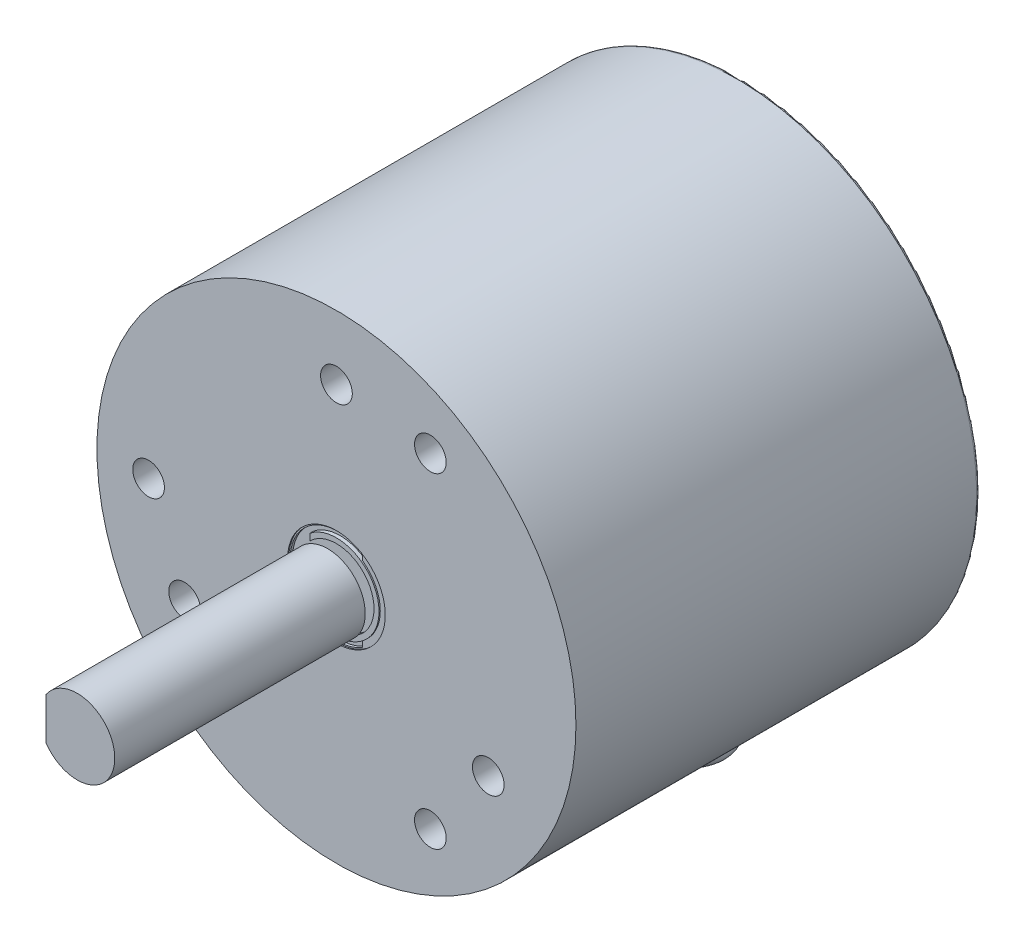
ISO-10303-21;
HEADER;
FILE_DESCRIPTION(('STEP AP214'),'2;1');
FILE_NAME('part.step','',(''),(''),'','','');
FILE_SCHEMA(('AUTOMOTIVE_DESIGN { 1 0 10303 214 1 1 1 1 }'));
ENDSEC;
DATA;
#1=APPLICATION_CONTEXT('core data for automotive mechanical design processes');
#2=APPLICATION_PROTOCOL_DEFINITION('international standard','automotive_design',2000,#1);
#3=PRODUCT_CONTEXT('',#1,'mechanical');
#4=PRODUCT('Part','Part','',(#3));
#5=PRODUCT_RELATED_PRODUCT_CATEGORY('part','',(#4));
#6=PRODUCT_DEFINITION_FORMATION('','',#4);
#7=PRODUCT_DEFINITION_CONTEXT('part definition',#1,'design');
#8=PRODUCT_DEFINITION('design','',#6,#7);
#9=PRODUCT_DEFINITION_SHAPE('','',#8);
#10=(LENGTH_UNIT() NAMED_UNIT(*) SI_UNIT(.MILLI.,.METRE.));
#11=(NAMED_UNIT(*) PLANE_ANGLE_UNIT() SI_UNIT($,.RADIAN.));
#12=(NAMED_UNIT(*) SI_UNIT($,.STERADIAN.) SOLID_ANGLE_UNIT());
#13=UNCERTAINTY_MEASURE_WITH_UNIT(LENGTH_MEASURE(1.E-05),#10,'distance_accuracy_value','');
#14=(GEOMETRIC_REPRESENTATION_CONTEXT(3) GLOBAL_UNCERTAINTY_ASSIGNED_CONTEXT((#13)) GLOBAL_UNIT_ASSIGNED_CONTEXT((#10,
#11,#12)) REPRESENTATION_CONTEXT('',''));
#15=CARTESIAN_POINT('',(0.,0.,0.));
#16=DIRECTION('',(0.,0.,1.));
#17=DIRECTION('',(1.,0.,0.));
#18=AXIS2_PLACEMENT_3D('',#15,#16,#17);
#19=CARTESIAN_POINT('',(0.,0.,34.95));
#20=DIRECTION('',(0.,0.,-1.));
#21=DIRECTION('',(-1.,0.,0.));
#22=AXIS2_PLACEMENT_3D('',#19,#20,#21);
#23=CYLINDRICAL_SURFACE('',#22,3.);
#24=DIRECTION('',(0.,0.,1.));
#25=VECTOR('',#24,1.);
#26=CARTESIAN_POINT('',(-2.10489428773529,2.13762018082243,34.95));
#27=LINE('',#26,#25);
#28=CARTESIAN_POINT('',(-2.10489428773529,2.13762018082243,34.25));
#29=VERTEX_POINT('',#28);
#30=CARTESIAN_POINT('',(-2.10489428773529,2.13762018082243,33.95));
#31=VERTEX_POINT('',#30);
#32=EDGE_CURVE('P0_E100',#29,#31,#27,.F.);
#33=ORIENTED_EDGE('',*,*,#32,.T.);
#34=CARTESIAN_POINT('',(0.,0.,33.95));
#35=DIRECTION('',(0.,0.,-1.));
#36=DIRECTION('',(-1.,0.,0.));
#37=AXIS2_PLACEMENT_3D('',#34,#35,#36);
#38=CIRCLE('',#37,3.);
#39=CARTESIAN_POINT('',(-2.10489428773529,-2.13762018082243,33.95));
#40=VERTEX_POINT('',#39);
#41=EDGE_CURVE('P0_E84',#40,#31,#38,.F.);
#42=ORIENTED_EDGE('',*,*,#41,.F.);
#43=DIRECTION('',(0.,0.,1.));
#44=VECTOR('',#43,1.);
#45=CARTESIAN_POINT('',(-2.10489428773529,-2.13762018082243,34.95));
#46=LINE('',#45,#44);
#47=CARTESIAN_POINT('',(-2.10489428773529,-2.13762018082243,34.25));
#48=VERTEX_POINT('',#47);
#49=EDGE_CURVE('P0_E82',#40,#48,#46,.T.);
#50=ORIENTED_EDGE('',*,*,#49,.T.);
#51=CARTESIAN_POINT('',(0.,0.,34.25));
#52=DIRECTION('',(0.,0.,-1.));
#53=DIRECTION('',(-1.,0.,0.));
#54=AXIS2_PLACEMENT_3D('',#51,#52,#53);
#55=CIRCLE('',#54,3.);
#56=EDGE_CURVE('P0_E20',#29,#48,#55,.T.);
#57=ORIENTED_EDGE('',*,*,#56,.F.);
#58=EDGE_LOOP('',(#33,#42,#50,#57));
#59=FACE_BOUND('',#58,.T.);
#60=ADVANCED_FACE('P0_F17',(#59),#23,.F.);
#61=CARTESIAN_POINT('',(0.,0.,34.25));
#62=DIRECTION('',(0.,0.,1.));
#63=DIRECTION('',(1.,0.,0.));
#64=AXIS2_PLACEMENT_3D('',#61,#62,#63);
#65=PLANE('',#64);
#66=ORIENTED_EDGE('',*,*,#56,.T.);
#67=DIRECTION('',(0.,1.,0.));
#68=VECTOR('',#67,1.);
#69=CARTESIAN_POINT('',(-2.10489428773529,-2.13762018082244,34.25));
#70=LINE('',#69,#68);
#71=CARTESIAN_POINT('',(-2.10489428773529,-2.67009738351607,34.25));
#72=VERTEX_POINT('',#71);
#73=EDGE_CURVE('P0_E88',#48,#72,#70,.F.);
#74=ORIENTED_EDGE('',*,*,#73,.T.);
#75=CARTESIAN_POINT('',(0.,0.,34.25));
#76=DIRECTION('',(0.,0.,-1.));
#77=DIRECTION('',(-1.,0.,0.));
#78=AXIS2_PLACEMENT_3D('',#75,#76,#77);
#79=CIRCLE('',#78,3.4);
#80=CARTESIAN_POINT('',(-2.10489428773529,2.67009738351607,34.25));
#81=VERTEX_POINT('',#80);
#82=EDGE_CURVE('P0_E534',#81,#72,#79,.T.);
#83=ORIENTED_EDGE('',*,*,#82,.F.);
#84=DIRECTION('',(0.,1.,0.));
#85=VECTOR('',#84,1.);
#86=CARTESIAN_POINT('',(-2.10489428773529,2.67009738351607,34.25));
#87=LINE('',#86,#85);
#88=EDGE_CURVE('P0_E94',#81,#29,#87,.F.);
#89=ORIENTED_EDGE('',*,*,#88,.T.);
#90=EDGE_LOOP('',(#66,#74,#83,#89));
#91=FACE_BOUND('',#90,.T.);
#92=ADVANCED_FACE('P0_F91',(#91),#65,.T.);
#93=CARTESIAN_POINT('',(-2.10489428773529,-2.13762018082244,34.95));
#94=DIRECTION('',(1.,0.,0.));
#95=DIRECTION('',(0.,1.,0.));
#96=AXIS2_PLACEMENT_3D('',#93,#94,#95);
#97=PLANE('',#96);
#98=ORIENTED_EDGE('',*,*,#49,.F.);
#99=DIRECTION('',(0.,1.,0.));
#100=VECTOR('',#99,1.);
#101=CARTESIAN_POINT('',(-2.10489428773529,0.,33.95));
#102=LINE('',#101,#100);
#103=CARTESIAN_POINT('',(-2.10489428773529,-2.67009738351607,33.95));
#104=VERTEX_POINT('',#103);
#105=EDGE_CURVE('P0_E106',#104,#40,#102,.T.);
#106=ORIENTED_EDGE('',*,*,#105,.F.);
#107=DIRECTION('',(0.,0.,-1.));
#108=VECTOR('',#107,1.);
#109=CARTESIAN_POINT('',(-2.10489428773529,-2.67009738351607,35.75));
#110=LINE('',#109,#108);
#111=EDGE_CURVE('P0_E98',#72,#104,#110,.T.);
#112=ORIENTED_EDGE('',*,*,#111,.F.);
#113=ORIENTED_EDGE('',*,*,#73,.F.);
#114=EDGE_LOOP('',(#98,#106,#112,#113));
#115=FACE_BOUND('',#114,.T.);
#116=ADVANCED_FACE('P0_F96',(#115),#97,.F.);
#117=CARTESIAN_POINT('',(-2.10489428773529,2.67009738351607,34.95));
#118=DIRECTION('',(1.,0.,0.));
#119=DIRECTION('',(0.,1.,0.));
#120=AXIS2_PLACEMENT_3D('',#117,#118,#119);
#121=PLANE('',#120);
#122=DIRECTION('',(0.,0.,-1.));
#123=VECTOR('',#122,1.);
#124=CARTESIAN_POINT('',(-2.10489428773529,2.67009738351607,35.75));
#125=LINE('',#124,#123);
#126=CARTESIAN_POINT('',(-2.10489428773529,2.67009738351607,33.95));
#127=VERTEX_POINT('',#126);
#128=EDGE_CURVE('P0_E529',#127,#81,#125,.F.);
#129=ORIENTED_EDGE('',*,*,#128,.F.);
#130=DIRECTION('',(0.,1.,0.));
#131=VECTOR('',#130,1.);
#132=CARTESIAN_POINT('',(-2.10489428773529,0.,33.95));
#133=LINE('',#132,#131);
#134=EDGE_CURVE('P0_E536',#31,#127,#133,.T.);
#135=ORIENTED_EDGE('',*,*,#134,.F.);
#136=ORIENTED_EDGE('',*,*,#32,.F.);
#137=ORIENTED_EDGE('',*,*,#88,.F.);
#138=EDGE_LOOP('',(#129,#135,#136,#137));
#139=FACE_BOUND('',#138,.T.);
#140=ADVANCED_FACE('P0_F236',(#139),#121,.F.);
#141=CARTESIAN_POINT('',(-0.899999985098838,0.,33.95));
#142=DIRECTION('',(0.,0.,1.));
#143=DIRECTION('',(1.,0.,0.));
#144=AXIS2_PLACEMENT_3D('',#141,#142,#143);
#145=PLANE('',#144);
#146=ORIENTED_EDGE('',*,*,#41,.T.);
#147=ORIENTED_EDGE('',*,*,#134,.T.);
#148=CARTESIAN_POINT('',(0.,0.,33.95));
#149=DIRECTION('',(0.,0.,-1.));
#150=DIRECTION('',(-1.,0.,0.));
#151=AXIS2_PLACEMENT_3D('',#148,#149,#150);
#152=CIRCLE('',#151,3.4);
#153=CARTESIAN_POINT('',(2.00000002980232,2.7495453952955,33.95));
#154=VERTEX_POINT('',#153);
#155=EDGE_CURVE('P0_E526',#154,#127,#152,.F.);
#156=ORIENTED_EDGE('',*,*,#155,.F.);
#157=DIRECTION('',(0.,1.,0.));
#158=VECTOR('',#157,1.);
#159=CARTESIAN_POINT('',(2.00000002980232,3.23109886583353,33.95));
#160=LINE('',#159,#158);
#161=CARTESIAN_POINT('',(2.00000002980232,3.23109886583353,33.95));
#162=VERTEX_POINT('',#161);
#163=EDGE_CURVE('P0_E535',#154,#162,#160,.T.);
#164=ORIENTED_EDGE('',*,*,#163,.T.);
#165=CARTESIAN_POINT('',(0.,0.,33.95));
#166=DIRECTION('',(0.,0.,-1.));
#167=DIRECTION('',(-1.,0.,0.));
#168=AXIS2_PLACEMENT_3D('',#165,#166,#167);
#169=CIRCLE('',#168,3.8);
#170=CARTESIAN_POINT('',(2.00000002980232,-3.23109886583353,33.95));
#171=VERTEX_POINT('',#170);
#172=EDGE_CURVE('P0_E523',#162,#171,#169,.F.);
#173=ORIENTED_EDGE('',*,*,#172,.T.);
#174=DIRECTION('',(0.,1.,0.));
#175=VECTOR('',#174,1.);
#176=CARTESIAN_POINT('',(2.00000002980232,-2.7495453952955,33.95));
#177=LINE('',#176,#175);
#178=CARTESIAN_POINT('',(2.00000002980232,-2.7495453952955,33.95));
#179=VERTEX_POINT('',#178);
#180=EDGE_CURVE('P0_E543',#171,#179,#177,.T.);
#181=ORIENTED_EDGE('',*,*,#180,.T.);
#182=CARTESIAN_POINT('',(0.,0.,33.95));
#183=DIRECTION('',(0.,0.,-1.));
#184=DIRECTION('',(-1.,0.,0.));
#185=AXIS2_PLACEMENT_3D('',#182,#183,#184);
#186=CIRCLE('',#185,3.4);
#187=EDGE_CURVE('P0_E531',#104,#179,#186,.F.);
#188=ORIENTED_EDGE('',*,*,#187,.F.);
#189=ORIENTED_EDGE('',*,*,#105,.T.);
#190=EDGE_LOOP('',(#146,#147,#156,#164,#173,#181,#188,#189));
#191=FACE_BOUND('',#190,.T.);
#192=ADVANCED_FACE('P0_F232',(#191),#145,.T.);
#193=CARTESIAN_POINT('',(2.00000002980232,3.23109886583353,34.95));
#194=DIRECTION('',(1.,0.,0.));
#195=DIRECTION('',(0.,0.,-1.));
#196=AXIS2_PLACEMENT_3D('',#193,#194,#195);
#197=PLANE('',#196);
#198=DIRECTION('',(0.,0.,-1.));
#199=VECTOR('',#198,1.);
#200=CARTESIAN_POINT('',(2.00000002980232,3.23109886583353,34.95));
#201=LINE('',#200,#199);
#202=CARTESIAN_POINT('',(2.00000002980232,3.23109886583353,34.15));
#203=VERTEX_POINT('',#202);
#204=EDGE_CURVE('P0_E525',#203,#162,#201,.T.);
#205=ORIENTED_EDGE('',*,*,#204,.T.);
#206=ORIENTED_EDGE('',*,*,#163,.F.);
#207=DIRECTION('',(0.,0.,-1.));
#208=VECTOR('',#207,1.);
#209=CARTESIAN_POINT('',(2.00000002980232,2.7495453952955,35.75));
#210=LINE('',#209,#208);
#211=CARTESIAN_POINT('',(2.00000002980232,2.7495453952955,34.15));
#212=VERTEX_POINT('',#211);
#213=EDGE_CURVE('P0_E530',#212,#154,#210,.T.);
#214=ORIENTED_EDGE('',*,*,#213,.F.);
#215=DIRECTION('',(0.,1.,0.));
#216=VECTOR('',#215,1.);
#217=CARTESIAN_POINT('',(2.00000002980232,0.,34.15));
#218=LINE('',#217,#216);
#219=EDGE_CURVE('P0_E522',#203,#212,#218,.F.);
#220=ORIENTED_EDGE('',*,*,#219,.F.);
#221=EDGE_LOOP('',(#205,#206,#214,#220));
#222=FACE_BOUND('',#221,.T.);
#223=ADVANCED_FACE('P0_F228',(#222),#197,.F.);
#224=CARTESIAN_POINT('',(0.,0.,35.75));
#225=DIRECTION('',(0.,0.,-1.));
#226=DIRECTION('',(-1.,0.,0.));
#227=AXIS2_PLACEMENT_3D('',#224,#225,#226);
#228=CYLINDRICAL_SURFACE('',#227,3.4);
#229=ORIENTED_EDGE('',*,*,#155,.T.);
#230=ORIENTED_EDGE('',*,*,#128,.T.);
#231=ORIENTED_EDGE('',*,*,#82,.T.);
#232=ORIENTED_EDGE('',*,*,#111,.T.);
#233=ORIENTED_EDGE('',*,*,#187,.T.);
#234=DIRECTION('',(0.,0.,-1.));
#235=VECTOR('',#234,1.);
#236=CARTESIAN_POINT('',(2.00000002980232,-2.7495453952955,34.95));
#237=LINE('',#236,#235);
#238=CARTESIAN_POINT('',(2.00000002980232,-2.7495453952955,34.15));
#239=VERTEX_POINT('',#238);
#240=EDGE_CURVE('P0_E545',#179,#239,#237,.F.);
#241=ORIENTED_EDGE('',*,*,#240,.T.);
#242=CARTESIAN_POINT('',(0.,0.,34.15));
#243=DIRECTION('',(0.,0.,-1.));
#244=DIRECTION('',(-1.,0.,0.));
#245=AXIS2_PLACEMENT_3D('',#242,#243,#244);
#246=CIRCLE('',#245,3.4);
#247=EDGE_CURVE('P0_E519',#212,#239,#246,.T.);
#248=ORIENTED_EDGE('',*,*,#247,.F.);
#249=ORIENTED_EDGE('',*,*,#213,.T.);
#250=EDGE_LOOP('',(#229,#230,#231,#232,#233,#241,#248,#249));
#251=FACE_BOUND('',#250,.T.);
#252=ADVANCED_FACE('P0_F225',(#251),#228,.T.);
#253=CARTESIAN_POINT('',(2.00000002980232,-2.7495453952955,34.95));
#254=DIRECTION('',(1.,0.,0.));
#255=DIRECTION('',(0.,0.,-1.));
#256=AXIS2_PLACEMENT_3D('',#253,#254,#255);
#257=PLANE('',#256);
#258=ORIENTED_EDGE('',*,*,#240,.F.);
#259=ORIENTED_EDGE('',*,*,#180,.F.);
#260=DIRECTION('',(0.,0.,-1.));
#261=VECTOR('',#260,1.);
#262=CARTESIAN_POINT('',(2.00000002980232,-3.23109886583353,34.95));
#263=LINE('',#262,#261);
#264=CARTESIAN_POINT('',(2.00000002980232,-3.23109886583353,34.15));
#265=VERTEX_POINT('',#264);
#266=EDGE_CURVE('P0_E35',#171,#265,#263,.F.);
#267=ORIENTED_EDGE('',*,*,#266,.T.);
#268=DIRECTION('',(0.,1.,0.));
#269=VECTOR('',#268,1.);
#270=CARTESIAN_POINT('',(2.00000002980232,0.,34.15));
#271=LINE('',#270,#269);
#272=EDGE_CURVE('P0_E518',#239,#265,#271,.F.);
#273=ORIENTED_EDGE('',*,*,#272,.F.);
#274=EDGE_LOOP('',(#258,#259,#267,#273));
#275=FACE_BOUND('',#274,.T.);
#276=ADVANCED_FACE('P0_F221',(#275),#257,.F.);
#277=CARTESIAN_POINT('',(0.,0.,34.95));
#278=DIRECTION('',(0.,0.,-1.));
#279=DIRECTION('',(-1.,0.,0.));
#280=AXIS2_PLACEMENT_3D('',#277,#278,#279);
#281=CYLINDRICAL_SURFACE('',#280,3.8);
#282=ORIENTED_EDGE('',*,*,#266,.F.);
#283=ORIENTED_EDGE('',*,*,#172,.F.);
#284=ORIENTED_EDGE('',*,*,#204,.F.);
#285=CARTESIAN_POINT('',(0.,0.,34.15));
#286=DIRECTION('',(0.,0.,-1.));
#287=DIRECTION('',(-1.,0.,0.));
#288=AXIS2_PLACEMENT_3D('',#285,#286,#287);
#289=CIRCLE('',#288,3.8);
#290=EDGE_CURVE('P0_E515',#265,#203,#289,.T.);
#291=ORIENTED_EDGE('',*,*,#290,.F.);
#292=EDGE_LOOP('',(#282,#283,#284,#291));
#293=FACE_BOUND('',#292,.T.);
#294=ADVANCED_FACE('P0_F217',(#293),#281,.F.);
#295=CARTESIAN_POINT('',(-15.,0.,29.25));
#296=DIRECTION('',(0.,0.,1.));
#297=DIRECTION('',(1.,0.,0.));
#298=AXIS2_PLACEMENT_3D('',#295,#296,#297);
#299=PLANE('',#298);
#300=CARTESIAN_POINT('',(-15.,0.,29.25));
#301=DIRECTION('',(0.,0.,-1.));
#302=DIRECTION('',(-1.,0.,0.));
#303=AXIS2_PLACEMENT_3D('',#300,#301,#302);
#304=CIRCLE('',#303,1.2645);
#305=CARTESIAN_POINT('',(-16.2645,0.,29.25));
#306=VERTEX_POINT('',#305);
#307=EDGE_CURVE('P0_E512',#306,#306,#304,.F.);
#308=ORIENTED_EDGE('',*,*,#307,.T.);
#309=EDGE_LOOP('',(#308));
#310=FACE_BOUND('',#309,.T.);
#311=ADVANCED_FACE('P0_F213',(#310),#299,.T.);
#312=CARTESIAN_POINT('',(7.5,12.9903810567666,29.25));
#313=DIRECTION('',(0.,0.,1.));
#314=DIRECTION('',(1.,0.,0.));
#315=AXIS2_PLACEMENT_3D('',#312,#313,#314);
#316=PLANE('',#315);
#317=CARTESIAN_POINT('',(7.5,12.9903810567666,29.25));
#318=DIRECTION('',(0.,0.,-1.));
#319=DIRECTION('',(-1.,0.,0.));
#320=AXIS2_PLACEMENT_3D('',#317,#318,#319);
#321=CIRCLE('',#320,1.2645);
#322=CARTESIAN_POINT('',(6.2355,12.9903810567666,29.25));
#323=VERTEX_POINT('',#322);
#324=EDGE_CURVE('P0_E509',#323,#323,#321,.F.);
#325=ORIENTED_EDGE('',*,*,#324,.T.);
#326=EDGE_LOOP('',(#325));
#327=FACE_BOUND('',#326,.T.);
#328=ADVANCED_FACE('P0_F209',(#327),#316,.T.);
#329=CARTESIAN_POINT('',(12.1243556529821,-7.00000000000001,29.25));
#330=DIRECTION('',(0.,0.,1.));
#331=DIRECTION('',(1.,0.,0.));
#332=AXIS2_PLACEMENT_3D('',#329,#330,#331);
#333=PLANE('',#332);
#334=CARTESIAN_POINT('',(12.1243556529821,-7.00000000000001,29.25));
#335=DIRECTION('',(0.,0.,-1.));
#336=DIRECTION('',(-1.,0.,0.));
#337=AXIS2_PLACEMENT_3D('',#334,#335,#336);
#338=CIRCLE('',#337,1.2645);
#339=CARTESIAN_POINT('',(10.8598556529821,-7.00000000000001,29.25));
#340=VERTEX_POINT('',#339);
#341=EDGE_CURVE('P0_E506',#340,#340,#338,.F.);
#342=ORIENTED_EDGE('',*,*,#341,.T.);
#343=EDGE_LOOP('',(#342));
#344=FACE_BOUND('',#343,.T.);
#345=ADVANCED_FACE('P0_F205',(#344),#333,.T.);
#346=CARTESIAN_POINT('',(-12.1243556529821,-7.,29.25));
#347=DIRECTION('',(0.,0.,1.));
#348=DIRECTION('',(1.,0.,0.));
#349=AXIS2_PLACEMENT_3D('',#346,#347,#348);
#350=PLANE('',#349);
#351=CARTESIAN_POINT('',(-12.1243556529821,-7.,29.25));
#352=DIRECTION('',(0.,0.,-1.));
#353=DIRECTION('',(-1.,0.,0.));
#354=AXIS2_PLACEMENT_3D('',#351,#352,#353);
#355=CIRCLE('',#354,1.2645);
#356=CARTESIAN_POINT('',(-13.3888556529821,-7.,29.25));
#357=VERTEX_POINT('',#356);
#358=EDGE_CURVE('P0_E503',#357,#357,#355,.F.);
#359=ORIENTED_EDGE('',*,*,#358,.T.);
#360=EDGE_LOOP('',(#359));
#361=FACE_BOUND('',#360,.T.);
#362=ADVANCED_FACE('P0_F201',(#361),#350,.T.);
#363=CARTESIAN_POINT('',(0.,14.,29.25));
#364=DIRECTION('',(0.,0.,1.));
#365=DIRECTION('',(1.,0.,0.));
#366=AXIS2_PLACEMENT_3D('',#363,#364,#365);
#367=PLANE('',#366);
#368=CARTESIAN_POINT('',(0.,14.,29.25));
#369=DIRECTION('',(0.,0.,-1.));
#370=DIRECTION('',(-1.,0.,0.));
#371=AXIS2_PLACEMENT_3D('',#368,#369,#370);
#372=CIRCLE('',#371,1.2645);
#373=CARTESIAN_POINT('',(-1.2645,14.,29.25));
#374=VERTEX_POINT('',#373);
#375=EDGE_CURVE('P0_E500',#374,#374,#372,.F.);
#376=ORIENTED_EDGE('',*,*,#375,.T.);
#377=EDGE_LOOP('',(#376));
#378=FACE_BOUND('',#377,.T.);
#379=ADVANCED_FACE('P0_F197',(#378),#367,.T.);
#380=CARTESIAN_POINT('',(7.5,-12.9903810567666,29.25));
#381=DIRECTION('',(0.,0.,1.));
#382=DIRECTION('',(1.,0.,0.));
#383=AXIS2_PLACEMENT_3D('',#380,#381,#382);
#384=PLANE('',#383);
#385=CARTESIAN_POINT('',(7.5,-12.9903810567666,29.25));
#386=DIRECTION('',(0.,0.,-1.));
#387=DIRECTION('',(-1.,0.,0.));
#388=AXIS2_PLACEMENT_3D('',#385,#386,#387);
#389=CIRCLE('',#388,1.2645);
#390=CARTESIAN_POINT('',(6.2355,-12.9903810567666,29.25));
#391=VERTEX_POINT('',#390);
#392=EDGE_CURVE('P0_E497',#391,#391,#389,.F.);
#393=ORIENTED_EDGE('',*,*,#392,.T.);
#394=EDGE_LOOP('',(#393));
#395=FACE_BOUND('',#394,.T.);
#396=ADVANCED_FACE('P0_F193',(#395),#384,.T.);
#397=CARTESIAN_POINT('',(0.,0.,34.15));
#398=DIRECTION('',(0.,0.,1.));
#399=DIRECTION('',(1.,0.,0.));
#400=AXIS2_PLACEMENT_3D('',#397,#398,#399);
#401=PLANE('',#400);
#402=ORIENTED_EDGE('',*,*,#272,.T.);
#403=ORIENTED_EDGE('',*,*,#290,.T.);
#404=ORIENTED_EDGE('',*,*,#219,.T.);
#405=ORIENTED_EDGE('',*,*,#247,.T.);
#406=EDGE_LOOP('',(#402,#403,#404,#405));
#407=FACE_BOUND('',#406,.T.);
#408=CARTESIAN_POINT('',(0.,0.,34.15));
#409=DIRECTION('',(0.,0.,-1.));
#410=DIRECTION('',(-1.,0.,0.));
#411=AXIS2_PLACEMENT_3D('',#408,#409,#410);
#412=CIRCLE('',#411,3.9);
#413=CARTESIAN_POINT('',(-3.9,0.,34.15));
#414=VERTEX_POINT('',#413);
#415=EDGE_CURVE('P0_E494',#414,#414,#412,.F.);
#416=ORIENTED_EDGE('',*,*,#415,.T.);
#417=EDGE_LOOP('',(#416));
#418=FACE_BOUND('',#417,.T.);
#419=ADVANCED_FACE('P0_F188',(#407,#418),#401,.T.);
#420=CARTESIAN_POINT('',(0.,-25.,6.00000008940697));
#421=DIRECTION('',(0.,1.,0.));
#422=DIRECTION('',(0.,0.,1.));
#423=AXIS2_PLACEMENT_3D('',#420,#421,#422);
#424=PLANE('',#423);
#425=CARTESIAN_POINT('',(0.,-25.,6.00000008940697));
#426=DIRECTION('',(0.,1.,0.));
#427=DIRECTION('',(0.,0.,1.));
#428=AXIS2_PLACEMENT_3D('',#425,#426,#427);
#429=CIRCLE('',#428,2.);
#430=CARTESIAN_POINT('',(0.,-25.,8.00000008940697));
#431=VERTEX_POINT('',#430);
#432=EDGE_CURVE('P0_E171',#431,#431,#429,.T.);
#433=ORIENTED_EDGE('',*,*,#432,.F.);
#434=EDGE_LOOP('',(#433));
#435=FACE_BOUND('',#434,.T.);
#436=ADVANCED_FACE('P0_F177',(#435),#424,.F.);
#437=CARTESIAN_POINT('',(0.,0.,2.));
#438=DIRECTION('',(0.,0.,1.));
#439=DIRECTION('',(1.,0.,0.));
#440=AXIS2_PLACEMENT_3D('',#437,#438,#439);
#441=PLANE('',#440);
#442=CARTESIAN_POINT('',(0.,0.,2.));
#443=DIRECTION('',(0.,0.,1.));
#444=DIRECTION('',(-1.,0.,0.));
#445=AXIS2_PLACEMENT_3D('',#442,#443,#444);
#446=CIRCLE('',#445,18.875);
#447=CARTESIAN_POINT('',(-18.875,0.,2.));
#448=VERTEX_POINT('',#447);
#449=EDGE_CURVE('P0_E489',#448,#448,#446,.T.);
#450=ORIENTED_EDGE('',*,*,#449,.F.);
#451=EDGE_LOOP('',(#450));
#452=FACE_BOUND('',#451,.T.);
#453=ADVANCED_FACE('P0_F187',(#452),#441,.F.);
#454=CARTESIAN_POINT('',(-15.,0.,36.25));
#455=DIRECTION('',(0.,0.,-1.));
#456=DIRECTION('',(-1.,0.,0.));
#457=AXIS2_PLACEMENT_3D('',#454,#455,#456);
#458=CYLINDRICAL_SURFACE('',#457,1.2645);
#459=ORIENTED_EDGE('',*,*,#307,.F.);
#460=EDGE_LOOP('',(#459));
#461=FACE_BOUND('',#460,.T.);
#462=CARTESIAN_POINT('',(-15.,0.,34.25));
#463=DIRECTION('',(0.,0.,-1.));
#464=DIRECTION('',(-1.,0.,0.));
#465=AXIS2_PLACEMENT_3D('',#462,#463,#464);
#466=CIRCLE('',#465,1.2645);
#467=CARTESIAN_POINT('',(-16.2645,0.,34.25));
#468=VERTEX_POINT('',#467);
#469=EDGE_CURVE('P0_E487',#468,#468,#466,.T.);
#470=ORIENTED_EDGE('',*,*,#469,.F.);
#471=EDGE_LOOP('',(#470));
#472=FACE_BOUND('',#471,.T.);
#473=ADVANCED_FACE('P0_F356',(#461,#472),#458,.F.);
#474=CARTESIAN_POINT('',(7.5,12.9903810567666,36.25));
#475=DIRECTION('',(0.,0.,-1.));
#476=DIRECTION('',(-1.,0.,0.));
#477=AXIS2_PLACEMENT_3D('',#474,#475,#476);
#478=CYLINDRICAL_SURFACE('',#477,1.2645);
#479=ORIENTED_EDGE('',*,*,#324,.F.);
#480=EDGE_LOOP('',(#479));
#481=FACE_BOUND('',#480,.T.);
#482=CARTESIAN_POINT('',(7.5,12.9903810567666,34.25));
#483=DIRECTION('',(0.,0.,-1.));
#484=DIRECTION('',(-1.,0.,0.));
#485=AXIS2_PLACEMENT_3D('',#482,#483,#484);
#486=CIRCLE('',#485,1.2645);
#487=CARTESIAN_POINT('',(6.2355,12.9903810567666,34.25));
#488=VERTEX_POINT('',#487);
#489=EDGE_CURVE('P0_E483',#488,#488,#486,.T.);
#490=ORIENTED_EDGE('',*,*,#489,.F.);
#491=EDGE_LOOP('',(#490));
#492=FACE_BOUND('',#491,.T.);
#493=ADVANCED_FACE('P0_F365',(#481,#492),#478,.F.);
#494=CARTESIAN_POINT('',(12.1243556529821,-7.00000000000001,36.25));
#495=DIRECTION('',(0.,0.,-1.));
#496=DIRECTION('',(-1.,0.,0.));
#497=AXIS2_PLACEMENT_3D('',#494,#495,#496);
#498=CYLINDRICAL_SURFACE('',#497,1.2645);
#499=ORIENTED_EDGE('',*,*,#341,.F.);
#500=EDGE_LOOP('',(#499));
#501=FACE_BOUND('',#500,.T.);
#502=CARTESIAN_POINT('',(12.1243556529821,-7.00000000000001,34.25));
#503=DIRECTION('',(0.,0.,-1.));
#504=DIRECTION('',(-1.,0.,0.));
#505=AXIS2_PLACEMENT_3D('',#502,#503,#504);
#506=CIRCLE('',#505,1.2645);
#507=CARTESIAN_POINT('',(10.8598556529821,-7.00000000000001,34.25));
#508=VERTEX_POINT('',#507);
#509=EDGE_CURVE('P0_E479',#508,#508,#506,.T.);
#510=ORIENTED_EDGE('',*,*,#509,.F.);
#511=EDGE_LOOP('',(#510));
#512=FACE_BOUND('',#511,.T.);
#513=ADVANCED_FACE('P0_F374',(#501,#512),#498,.F.);
#514=CARTESIAN_POINT('',(-12.1243556529821,-7.,36.25));
#515=DIRECTION('',(0.,0.,-1.));
#516=DIRECTION('',(-1.,0.,0.));
#517=AXIS2_PLACEMENT_3D('',#514,#515,#516);
#518=CYLINDRICAL_SURFACE('',#517,1.2645);
#519=ORIENTED_EDGE('',*,*,#358,.F.);
#520=EDGE_LOOP('',(#519));
#521=FACE_BOUND('',#520,.T.);
#522=CARTESIAN_POINT('',(-12.1243556529821,-7.,34.25));
#523=DIRECTION('',(0.,0.,-1.));
#524=DIRECTION('',(-1.,0.,0.));
#525=AXIS2_PLACEMENT_3D('',#522,#523,#524);
#526=CIRCLE('',#525,1.2645);
#527=CARTESIAN_POINT('',(-13.3888556529821,-7.,34.25));
#528=VERTEX_POINT('',#527);
#529=EDGE_CURVE('P0_E475',#528,#528,#526,.T.);
#530=ORIENTED_EDGE('',*,*,#529,.F.);
#531=EDGE_LOOP('',(#530));
#532=FACE_BOUND('',#531,.T.);
#533=ADVANCED_FACE('P0_F384',(#521,#532),#518,.F.);
#534=CARTESIAN_POINT('',(0.,14.,36.25));
#535=DIRECTION('',(0.,0.,-1.));
#536=DIRECTION('',(-1.,0.,0.));
#537=AXIS2_PLACEMENT_3D('',#534,#535,#536);
#538=CYLINDRICAL_SURFACE('',#537,1.2645);
#539=ORIENTED_EDGE('',*,*,#375,.F.);
#540=EDGE_LOOP('',(#539));
#541=FACE_BOUND('',#540,.T.);
#542=CARTESIAN_POINT('',(0.,14.,34.25));
#543=DIRECTION('',(0.,0.,-1.));
#544=DIRECTION('',(-1.,0.,0.));
#545=AXIS2_PLACEMENT_3D('',#542,#543,#544);
#546=CIRCLE('',#545,1.2645);
#547=CARTESIAN_POINT('',(-1.2645,14.,34.25));
#548=VERTEX_POINT('',#547);
#549=EDGE_CURVE('P0_E471',#548,#548,#546,.T.);
#550=ORIENTED_EDGE('',*,*,#549,.F.);
#551=EDGE_LOOP('',(#550));
#552=FACE_BOUND('',#551,.T.);
#553=ADVANCED_FACE('P0_F394',(#541,#552),#538,.F.);
#554=CARTESIAN_POINT('',(7.5,-12.9903810567666,36.25));
#555=DIRECTION('',(0.,0.,-1.));
#556=DIRECTION('',(-1.,0.,0.));
#557=AXIS2_PLACEMENT_3D('',#554,#555,#556);
#558=CYLINDRICAL_SURFACE('',#557,1.2645);
#559=ORIENTED_EDGE('',*,*,#392,.F.);
#560=EDGE_LOOP('',(#559));
#561=FACE_BOUND('',#560,.T.);
#562=CARTESIAN_POINT('',(7.5,-12.9903810567666,34.25));
#563=DIRECTION('',(0.,0.,-1.));
#564=DIRECTION('',(-1.,0.,0.));
#565=AXIS2_PLACEMENT_3D('',#562,#563,#564);
#566=CIRCLE('',#565,1.2645);
#567=CARTESIAN_POINT('',(6.2355,-12.9903810567666,34.25));
#568=VERTEX_POINT('',#567);
#569=EDGE_CURVE('P0_E467',#568,#568,#566,.T.);
#570=ORIENTED_EDGE('',*,*,#569,.F.);
#571=EDGE_LOOP('',(#570));
#572=FACE_BOUND('',#571,.T.);
#573=ADVANCED_FACE('P0_F404',(#561,#572),#558,.F.);
#574=CARTESIAN_POINT('',(0.,0.,35.75));
#575=DIRECTION('',(0.,0.,-1.));
#576=DIRECTION('',(-1.,0.,0.));
#577=AXIS2_PLACEMENT_3D('',#574,#575,#576);
#578=CYLINDRICAL_SURFACE('',#577,3.9);
#579=ORIENTED_EDGE('',*,*,#415,.F.);
#580=EDGE_LOOP('',(#579));
#581=FACE_BOUND('',#580,.T.);
#582=CARTESIAN_POINT('',(0.,0.,34.25));
#583=DIRECTION('',(0.,0.,-1.));
#584=DIRECTION('',(-1.,0.,0.));
#585=AXIS2_PLACEMENT_3D('',#582,#583,#584);
#586=CIRCLE('',#585,3.9);
#587=CARTESIAN_POINT('',(-3.9,0.,34.25));
#588=VERTEX_POINT('',#587);
#589=EDGE_CURVE('P0_E139',#588,#588,#586,.T.);
#590=ORIENTED_EDGE('',*,*,#589,.F.);
#591=EDGE_LOOP('',(#590));
#592=FACE_BOUND('',#591,.T.);
#593=ADVANCED_FACE('P0_F414',(#581,#592),#578,.F.);
#594=CARTESIAN_POINT('',(0.,-24.,6.00000008940697));
#595=DIRECTION('',(0.,-1.,0.));
#596=DIRECTION('',(0.,0.,-1.));
#597=AXIS2_PLACEMENT_3D('',#594,#595,#596);
#598=TOROIDAL_SURFACE('',#597,2.,1.);
#599=CARTESIAN_POINT('',(0.,-24.,6.00000008940697));
#600=DIRECTION('',(0.,-1.,0.));
#601=DIRECTION('',(0.,0.,-1.));
#602=AXIS2_PLACEMENT_3D('',#599,#600,#601);
#603=CIRCLE('',#602,3.);
#604=CARTESIAN_POINT('',(0.,-24.,3.00000008940697));
#605=VERTEX_POINT('',#604);
#606=EDGE_CURVE('P0_E136',#605,#605,#603,.F.);
#607=ORIENTED_EDGE('',*,*,#606,.F.);
#608=EDGE_LOOP('',(#607));
#609=FACE_BOUND('',#608,.T.);
#610=ORIENTED_EDGE('',*,*,#432,.T.);
#611=EDGE_LOOP('',(#610));
#612=FACE_BOUND('',#611,.T.);
#613=ADVANCED_FACE('P0_F151',(#609,#612),#598,.T.);
#614=CARTESIAN_POINT('',(0.,0.,2.25));
#615=DIRECTION('',(0.,0.,1.));
#616=DIRECTION('',(1.,0.,0.));
#617=AXIS2_PLACEMENT_3D('',#614,#615,#616);
#618=TOROIDAL_SURFACE('',#617,18.875,0.25);
#619=ORIENTED_EDGE('',*,*,#449,.T.);
#620=EDGE_LOOP('',(#619));
#621=FACE_BOUND('',#620,.T.);
#622=CARTESIAN_POINT('',(0.,0.,2.25));
#623=DIRECTION('',(0.,0.,1.));
#624=DIRECTION('',(1.,0.,0.));
#625=AXIS2_PLACEMENT_3D('',#622,#623,#624);
#626=CIRCLE('',#625,19.125);
#627=CARTESIAN_POINT('',(19.125,0.,2.25));
#628=VERTEX_POINT('',#627);
#629=EDGE_CURVE('P0_E134',#628,#628,#626,.T.);
#630=ORIENTED_EDGE('',*,*,#629,.F.);
#631=EDGE_LOOP('',(#630));
#632=FACE_BOUND('',#631,.T.);
#633=ADVANCED_FACE('P0_F147',(#621,#632),#618,.T.);
#634=CARTESIAN_POINT('',(0.,0.,34.25));
#635=DIRECTION('',(0.,0.,1.));
#636=DIRECTION('',(1.,0.,0.));
#637=AXIS2_PLACEMENT_3D('',#634,#635,#636);
#638=PLANE('',#637);
#639=ORIENTED_EDGE('',*,*,#589,.T.);
#640=EDGE_LOOP('',(#639));
#641=FACE_BOUND('',#640,.T.);
#642=ORIENTED_EDGE('',*,*,#569,.T.);
#643=EDGE_LOOP('',(#642));
#644=FACE_BOUND('',#643,.T.);
#645=ORIENTED_EDGE('',*,*,#549,.T.);
#646=EDGE_LOOP('',(#645));
#647=FACE_BOUND('',#646,.T.);
#648=ORIENTED_EDGE('',*,*,#529,.T.);
#649=EDGE_LOOP('',(#648));
#650=FACE_BOUND('',#649,.T.);
#651=ORIENTED_EDGE('',*,*,#509,.T.);
#652=EDGE_LOOP('',(#651));
#653=FACE_BOUND('',#652,.T.);
#654=ORIENTED_EDGE('',*,*,#489,.T.);
#655=EDGE_LOOP('',(#654));
#656=FACE_BOUND('',#655,.T.);
#657=ORIENTED_EDGE('',*,*,#469,.T.);
#658=EDGE_LOOP('',(#657));
#659=FACE_BOUND('',#658,.T.);
#660=CARTESIAN_POINT('',(0.,0.,34.25));
#661=DIRECTION('',(0.,0.,1.));
#662=DIRECTION('',(1.,0.,0.));
#663=AXIS2_PLACEMENT_3D('',#660,#661,#662);
#664=CIRCLE('',#663,19.125);
#665=CARTESIAN_POINT('',(19.125,0.,34.25));
#666=VERTEX_POINT('',#665);
#667=EDGE_CURVE('P0_E26',#666,#666,#664,.F.);
#668=ORIENTED_EDGE('',*,*,#667,.F.);
#669=EDGE_LOOP('',(#668));
#670=FACE_BOUND('',#669,.T.);
#671=ADVANCED_FACE('P0_F125',(#641,#644,#647,#650,#653,#656,#659,#670),#638,.T.);
#672=CARTESIAN_POINT('',(0.,0.,6.00000008940697));
#673=DIRECTION('',(0.,-1.,0.));
#674=DIRECTION('',(0.,0.,-1.));
#675=AXIS2_PLACEMENT_3D('',#672,#673,#674);
#676=CYLINDRICAL_SURFACE('',#675,3.);
#677=CARTESIAN_POINT('',(3.,-18.8882403891945,6.00000008940697));
#678=CARTESIAN_POINT('',(2.99999237317712,-18.8882435056235,5.83276579788536));
#679=CARTESIAN_POINT('',(2.98595727411593,-18.8904873282168,5.66531653732124));
#680=CARTESIAN_POINT('',(2.93017314269822,-18.8992189522483,5.33498308636322));
#681=CARTESIAN_POINT('',(2.88836744546232,-18.9057154306782,5.17210894103727));
#682=CARTESIAN_POINT('',(2.77832473320494,-18.9221988628879,4.85593793286243));
#683=CARTESIAN_POINT('',(2.71011978672829,-18.9321815803189,4.70262971116005));
#684=CARTESIAN_POINT('',(2.54928524527678,-18.9545068304269,4.40969688757143));
#685=CARTESIAN_POINT('',(2.45666498662348,-18.9668484605698,4.27006708304595));
#686=CARTESIAN_POINT('',(2.24874512972931,-18.9926248738739,4.00714954911764));
#687=CARTESIAN_POINT('',(2.13327160897171,-19.0060675453954,3.88400010529178));
#688=CARTESIAN_POINT('',(1.88329353691466,-19.0324616644253,3.65873584201126));
#689=CARTESIAN_POINT('',(1.74878693527306,-19.0454130588199,3.5566232916742));
#690=CARTESIAN_POINT('',(1.46368971780508,-19.0694461693133,3.37583364637611));
#691=CARTESIAN_POINT('',(1.313018413307,-19.0805177187884,3.2972823267601));
#692=CARTESIAN_POINT('',(1.0004189861251,-19.0994574960831,3.16665360030506));
#693=CARTESIAN_POINT('',(0.838491611308232,-19.1073259364836,3.11457443653144));
#694=CARTESIAN_POINT('',(0.509382849980522,-19.1189181436564,3.03878257140043));
#695=CARTESIAN_POINT('',(0.342255367334647,-19.1226753336429,3.01484100004331));
#696=CARTESIAN_POINT('',(0.00631566954864443,-19.1257363749953,2.9952928837157));
#697=CARTESIAN_POINT('',(-0.162496445851017,-19.1250404884667,2.9996846710601));
#698=CARTESIAN_POINT('',(-0.495448829299951,-19.1193003991545,3.03649876532238));
#699=CARTESIAN_POINT('',(-0.659617106267324,-19.1142944373109,3.06867456720336));
#700=CARTESIAN_POINT('',(-0.980196507100088,-19.1005392181865,3.15975638707584));
#701=CARTESIAN_POINT('',(-1.13660735149797,-19.0917898261548,3.21866336730393));
#702=CARTESIAN_POINT('',(-1.43797622298836,-19.0714650142458,3.36178702319966));
#703=CARTESIAN_POINT('',(-1.5828841840525,-19.0598780509368,3.44610741401022));
#704=CARTESIAN_POINT('',(-1.85657558993049,-19.0351690875137,3.63758149891212));
#705=CARTESIAN_POINT('',(-1.98535913478569,-19.0220470969244,3.74473505132763));
#706=CARTESIAN_POINT('',(-2.22459085650667,-18.9955649177806,3.98018335162295));
#707=CARTESIAN_POINT('',(-2.33483090072671,-18.9822036774141,4.10868953596544));
#708=CARTESIAN_POINT('',(-2.53226535294356,-18.956877414392,4.38255387501278));
#709=CARTESIAN_POINT('',(-2.61944934628629,-18.944913024066,4.52791960284122));
#710=CARTESIAN_POINT('',(-2.76832265180782,-18.9237338093627,4.83164253622217));
#711=CARTESIAN_POINT('',(-2.82996808995578,-18.9145237242372,4.99002154337164));
#712=CARTESIAN_POINT('',(-2.92559860018522,-18.8999702153489,5.3148525583552));
#713=CARTESIAN_POINT('',(-2.95964214166313,-18.8946186207826,5.48128670562304));
#714=CARTESIAN_POINT('',(-2.98627711687596,-18.8904155174055,5.7074248150508));
#715=CARTESIAN_POINT('',(-2.99141911569892,-18.8896016139025,5.76581102559485));
#716=CARTESIAN_POINT('',(-2.99828189534101,-18.8885135033927,5.88278938323172));
#717=CARTESIAN_POINT('',(-3.00000267333549,-18.8882392968314,5.94138153049452));
#718=CARTESIAN_POINT('',(-2.99999237317712,-18.8882435056235,6.16723438092858));
#719=CARTESIAN_POINT('',(-2.98595727411593,-18.8904873282168,6.3346836414927));
#720=CARTESIAN_POINT('',(-2.93017314269822,-18.8992189522483,6.66501709245072));
#721=CARTESIAN_POINT('',(-2.88836744546232,-18.9057154306782,6.82789123777667));
#722=CARTESIAN_POINT('',(-2.77832473320494,-18.9221988628879,7.14406224595151));
#723=CARTESIAN_POINT('',(-2.71011978672829,-18.9321815803189,7.29737046765389));
#724=CARTESIAN_POINT('',(-2.54928524527678,-18.9545068304269,7.59030329124252));
#725=CARTESIAN_POINT('',(-2.45666498662348,-18.9668484605698,7.72993309576799));
#726=CARTESIAN_POINT('',(-2.24874512972931,-18.9926248738739,7.9928506296963));
#727=CARTESIAN_POINT('',(-2.1332716089717,-19.0060675453954,8.11600007352216));
#728=CARTESIAN_POINT('',(-1.88329353691466,-19.0324616644253,8.34126433680268));
#729=CARTESIAN_POINT('',(-1.74878693527306,-19.0454130588199,8.44337688713974));
#730=CARTESIAN_POINT('',(-1.46368971780508,-19.0694461693133,8.62416653243783));
#731=CARTESIAN_POINT('',(-1.313018413307,-19.0805177187884,8.70271785205384));
#732=CARTESIAN_POINT('',(-1.0004189861251,-19.0994574960831,8.83334657850888));
#733=CARTESIAN_POINT('',(-0.838491611308232,-19.1073259364836,8.8854257422825));
#734=CARTESIAN_POINT('',(-0.509382849980521,-19.1189181436564,8.96121760741351));
#735=CARTESIAN_POINT('',(-0.342255367334646,-19.1226753336429,8.98515917877063));
#736=CARTESIAN_POINT('',(-0.00631566954864362,-19.1257363749953,9.00470729509824));
#737=CARTESIAN_POINT('',(0.162496445851018,-19.1250404884667,9.00031550775384));
#738=CARTESIAN_POINT('',(0.495448829299952,-19.1193003991545,8.96350141349156));
#739=CARTESIAN_POINT('',(0.659617106267324,-19.1142944373109,8.93132561161058));
#740=CARTESIAN_POINT('',(0.980196507100089,-19.1005392181865,8.8402437917381));
#741=CARTESIAN_POINT('',(1.13660735149797,-19.0917898261548,8.78133681151001));
#742=CARTESIAN_POINT('',(1.43797622298836,-19.0714650142458,8.63821315561428));
#743=CARTESIAN_POINT('',(1.5828841840525,-19.0598780509368,8.55389276480371));
#744=CARTESIAN_POINT('',(1.85657558993049,-19.0351690875137,8.36241867990182));
#745=CARTESIAN_POINT('',(1.98535913478569,-19.0220470969244,8.25526512748631));
#746=CARTESIAN_POINT('',(2.22459085650666,-18.9955649177806,8.01981682719099));
#747=CARTESIAN_POINT('',(2.33483090072671,-18.9822036774141,7.8913106428485));
#748=CARTESIAN_POINT('',(2.53226535294356,-18.956877414392,7.61744630380116));
#749=CARTESIAN_POINT('',(2.61944934628629,-18.944913024066,7.47208057597271));
#750=CARTESIAN_POINT('',(2.76832265180782,-18.9237338093627,7.16835764259177));
#751=CARTESIAN_POINT('',(2.82996808995578,-18.9145237242372,7.00997863544231));
#752=CARTESIAN_POINT('',(2.92559860018522,-18.8999702153489,6.68514762045874));
#753=CARTESIAN_POINT('',(2.95964214166313,-18.8946186207826,6.5187134731909));
#754=CARTESIAN_POINT('',(2.98627711687596,-18.8904155174055,6.29257536376315));
#755=CARTESIAN_POINT('',(2.99141911569892,-18.8896016139025,6.23418915321909));
#756=CARTESIAN_POINT('',(2.99828189534101,-18.8885135033927,6.11721079558222));
#757=CARTESIAN_POINT('',(3.00000267333549,-18.8882392968314,6.05861864831942));
#758=CARTESIAN_POINT('',(3.,-18.8882403891945,6.00000008940697));
#759=B_SPLINE_CURVE_WITH_KNOTS('',3,(#677,#678,#679,#680,#681,#682,#683,#684,#685,#686,#687,
#688,#689,#690,#691,#692,#693,#694,#695,#696,#697,#698,#699,#700,#701,#702,#703,#704,#705,#706,
#707,#708,#709,#710,#711,#712,#713,#714,#715,#716,#717,#718,#719,#720,#721,#722,#723,#724,#725,
#726,#727,#728,#729,#730,#731,#732,#733,#734,#735,#736,#737,#738,#739,#740,#741,#742,#743,#744,
#745,#746,#747,#748,#749,#750,#751,#752,#753,#754,#755,#756,#757,#758),.UNSPECIFIED.,.T.,.F.,(4,
2,2,2,2,2,2,2,2,2,2,2,2,2,2,2,2,2,2,2,2,2,2,2,2,2,2,2,2,2,2,2,2,2,2,2,2,2,2,2,4),(0.,
0.501479141447158,1.00398468862755,1.50588172223282,2.00758711005214,2.51326865081688,
3.01900470774903,3.52739432564026,4.03575019773549,4.53994186032979,5.04410384676523,
5.54383824131115,6.04359062611769,6.54541083106514,7.04722792239571,7.55434777807893,
8.06169631522054,8.56991287453568,9.07705003966585,9.25282714888598,9.42860440323269,
9.93008354467985,10.4325890918602,10.9344861254655,11.4361915132848,11.9418730540496,
12.4476091109817,12.9559987288729,13.4643546009682,13.9685462635625,14.4727082499979,
14.9724426445438,15.4721950293504,15.9740152342978,16.4758323256284,16.9829521813116,
17.4903007184532,17.9985172777684,18.5056544428985,18.6814315521187,18.8572088064654),.UNSPECIFIED.);
#760=CARTESIAN_POINT('',(3.,-18.8882403891945,6.00000008940697));
#761=VERTEX_POINT('',#760);
#762=EDGE_CURVE('P0_E11',#761,#761,#759,.T.);
#763=ORIENTED_EDGE('',*,*,#762,.F.);
#764=EDGE_LOOP('',(#763));
#765=FACE_BOUND('',#764,.T.);
#766=ORIENTED_EDGE('',*,*,#606,.T.);
#767=EDGE_LOOP('',(#766));
#768=FACE_BOUND('',#767,.T.);
#769=ADVANCED_FACE('P0_F114',(#765,#768),#676,.T.);
#770=CARTESIAN_POINT('',(0.,0.,0.));
#771=DIRECTION('',(0.,0.,1.));
#772=DIRECTION('',(1.,0.,0.));
#773=AXIS2_PLACEMENT_3D('',#770,#771,#772);
#774=CYLINDRICAL_SURFACE('',#773,19.125);
#775=ORIENTED_EDGE('',*,*,#667,.T.);
#776=EDGE_LOOP('',(#775));
#777=FACE_BOUND('',#776,.T.);
#778=ORIENTED_EDGE('',*,*,#762,.T.);
#779=EDGE_LOOP('',(#778));
#780=FACE_BOUND('',#779,.T.);
#781=ORIENTED_EDGE('',*,*,#629,.T.);
#782=EDGE_LOOP('',(#781));
#783=FACE_BOUND('',#782,.T.);
#784=ADVANCED_FACE('P0_F117',(#777,#780,#783),#774,.T.);
#785=CLOSED_SHELL('',(#60,#92,#116,#140,#192,#223,#252,#276,#294,#311,#328,#345,#362,#379,#396,
#419,#436,#453,#473,#493,#513,#533,#553,#573,#593,#613,#633,#671,#769,#784));
#786=MANIFOLD_SOLID_BREP('P0_B1',#785);
#787=CARTESIAN_POINT('',(0.253921876742177,0.,34.95));
#788=DIRECTION('',(0.,0.,1.));
#789=DIRECTION('',(1.,0.,0.));
#790=AXIS2_PLACEMENT_3D('',#787,#788,#789);
#791=PLANE('',#790);
#792=DIRECTION('',(0.,-1.,0.));
#793=VECTOR('',#792,1.);
#794=CARTESIAN_POINT('',(-2.49215624651565,1.67007701707228,34.95));
#795=LINE('',#794,#793);
#796=CARTESIAN_POINT('',(-2.49215624651565,1.67007701707228,34.95));
#797=VERTEX_POINT('',#796);
#798=CARTESIAN_POINT('',(-2.49215624651565,-1.67007701707228,34.95));
#799=VERTEX_POINT('',#798);
#800=EDGE_CURVE('P1_E43',#797,#799,#795,.T.);
#801=ORIENTED_EDGE('',*,*,#800,.F.);
#802=CARTESIAN_POINT('',(0.,0.,34.95));
#803=DIRECTION('',(0.,0.,1.));
#804=DIRECTION('',(1.,0.,0.));
#805=AXIS2_PLACEMENT_3D('',#802,#803,#804);
#806=CIRCLE('',#805,3.);
#807=EDGE_CURVE('P1_E20',#799,#797,#806,.T.);
#808=ORIENTED_EDGE('',*,*,#807,.F.);
#809=EDGE_LOOP('',(#801,#808));
#810=FACE_BOUND('',#809,.T.);
#811=ADVANCED_FACE('P1_F17',(#810),#791,.F.);
#812=CARTESIAN_POINT('',(0.253921876742177,0.,54.95));
#813=DIRECTION('',(0.,0.,1.));
#814=DIRECTION('',(1.,0.,0.));
#815=AXIS2_PLACEMENT_3D('',#812,#813,#814);
#816=PLANE('',#815);
#817=CARTESIAN_POINT('',(0.,0.,54.95));
#818=DIRECTION('',(0.,0.,1.));
#819=DIRECTION('',(1.,0.,0.));
#820=AXIS2_PLACEMENT_3D('',#817,#818,#819);
#821=CIRCLE('',#820,3.);
#822=CARTESIAN_POINT('',(-2.49215624651565,1.67007701707228,54.95));
#823=VERTEX_POINT('',#822);
#824=CARTESIAN_POINT('',(-2.49215624651565,-1.67007701707228,54.95));
#825=VERTEX_POINT('',#824);
#826=EDGE_CURVE('P1_E26',#823,#825,#821,.F.);
#827=ORIENTED_EDGE('',*,*,#826,.F.);
#828=DIRECTION('',(0.,-1.,0.));
#829=VECTOR('',#828,1.);
#830=CARTESIAN_POINT('',(-2.49215624651565,1.67007701707228,54.95));
#831=LINE('',#830,#829);
#832=EDGE_CURVE('P1_E34',#825,#823,#831,.F.);
#833=ORIENTED_EDGE('',*,*,#832,.F.);
#834=EDGE_LOOP('',(#827,#833));
#835=FACE_BOUND('',#834,.T.);
#836=ADVANCED_FACE('P1_F55',(#835),#816,.T.);
#837=CARTESIAN_POINT('',(-2.49215624651565,1.67007701707228,34.95));
#838=DIRECTION('',(-1.,0.,0.));
#839=DIRECTION('',(0.,-1.,0.));
#840=AXIS2_PLACEMENT_3D('',#837,#838,#839);
#841=PLANE('',#840);
#842=ORIENTED_EDGE('',*,*,#832,.T.);
#843=DIRECTION('',(0.,0.,1.));
#844=VECTOR('',#843,1.);
#845=CARTESIAN_POINT('',(-2.49215624651565,1.67007701707228,34.95));
#846=LINE('',#845,#844);
#847=EDGE_CURVE('P1_E48',#797,#823,#846,.T.);
#848=ORIENTED_EDGE('',*,*,#847,.F.);
#849=ORIENTED_EDGE('',*,*,#800,.T.);
#850=DIRECTION('',(0.,0.,1.));
#851=VECTOR('',#850,1.);
#852=CARTESIAN_POINT('',(-2.49215624651565,-1.67007701707228,34.95));
#853=LINE('',#852,#851);
#854=EDGE_CURVE('P1_E11',#825,#799,#853,.F.);
#855=ORIENTED_EDGE('',*,*,#854,.F.);
#856=EDGE_LOOP('',(#842,#848,#849,#855));
#857=FACE_BOUND('',#856,.T.);
#858=ADVANCED_FACE('P1_F49',(#857),#841,.T.);
#859=CARTESIAN_POINT('',(0.,0.,34.95));
#860=DIRECTION('',(0.,0.,1.));
#861=DIRECTION('',(1.,0.,0.));
#862=AXIS2_PLACEMENT_3D('',#859,#860,#861);
#863=CYLINDRICAL_SURFACE('',#862,3.);
#864=ORIENTED_EDGE('',*,*,#826,.T.);
#865=ORIENTED_EDGE('',*,*,#854,.T.);
#866=ORIENTED_EDGE('',*,*,#807,.T.);
#867=ORIENTED_EDGE('',*,*,#847,.T.);
#868=EDGE_LOOP('',(#864,#865,#866,#867));
#869=FACE_BOUND('',#868,.T.);
#870=ADVANCED_FACE('P1_F53',(#869),#863,.T.);
#871=CLOSED_SHELL('',(#811,#836,#858,#870));
#872=MANIFOLD_SOLID_BREP('P1_B1',#871);
#873=ADVANCED_BREP_SHAPE_REPRESENTATION('',(#18,#786,#872),#14);
#874=SHAPE_DEFINITION_REPRESENTATION(#9,#873);
ENDSEC;
END-ISO-10303-21;
